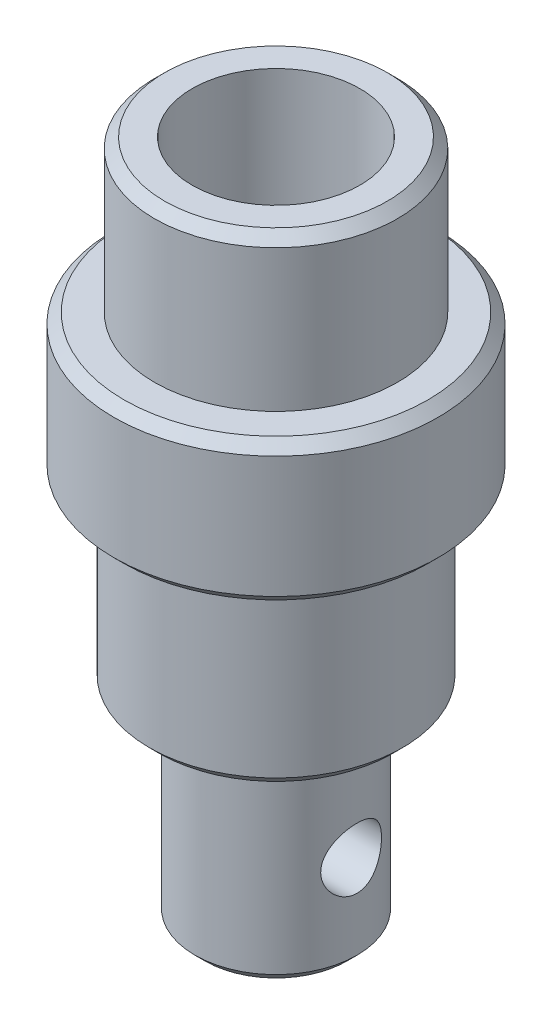
ISO-10303-21;
HEADER;
FILE_DESCRIPTION(('STEP AP214'),'2;1');
FILE_NAME('part.step','',(''),(''),'','','');
FILE_SCHEMA(('AUTOMOTIVE_DESIGN { 1 0 10303 214 1 1 1 1 }'));
ENDSEC;
DATA;
#1=APPLICATION_CONTEXT('core data for automotive mechanical design processes');
#2=APPLICATION_PROTOCOL_DEFINITION('international standard','automotive_design',2000,#1);
#3=PRODUCT_CONTEXT('',#1,'mechanical');
#4=PRODUCT('Part','Part','',(#3));
#5=PRODUCT_RELATED_PRODUCT_CATEGORY('part','',(#4));
#6=PRODUCT_DEFINITION_FORMATION('','',#4);
#7=PRODUCT_DEFINITION_CONTEXT('part definition',#1,'design');
#8=PRODUCT_DEFINITION('design','',#6,#7);
#9=PRODUCT_DEFINITION_SHAPE('','',#8);
#10=(LENGTH_UNIT() NAMED_UNIT(*) SI_UNIT(.MILLI.,.METRE.));
#11=(NAMED_UNIT(*) PLANE_ANGLE_UNIT() SI_UNIT($,.RADIAN.));
#12=(NAMED_UNIT(*) SI_UNIT($,.STERADIAN.) SOLID_ANGLE_UNIT());
#13=UNCERTAINTY_MEASURE_WITH_UNIT(LENGTH_MEASURE(1.E-05),#10,'distance_accuracy_value','');
#14=(GEOMETRIC_REPRESENTATION_CONTEXT(3) GLOBAL_UNCERTAINTY_ASSIGNED_CONTEXT((#13)) GLOBAL_UNIT_ASSIGNED_CONTEXT((#10,
#11,#12)) REPRESENTATION_CONTEXT('',''));
#15=CARTESIAN_POINT('',(0.,0.,0.));
#16=DIRECTION('',(0.,0.,1.));
#17=DIRECTION('',(1.,0.,0.));
#18=AXIS2_PLACEMENT_3D('',#15,#16,#17);
#19=CARTESIAN_POINT('',(0.,67.,0.));
#20=DIRECTION('',(0.,-1.,0.));
#21=DIRECTION('',(0.,0.,-1.));
#22=AXIS2_PLACEMENT_3D('',#19,#20,#21);
#23=CYLINDRICAL_SURFACE('',#22,12.5);
#24=CARTESIAN_POINT('',(0.,21.,0.));
#25=DIRECTION('',(0.,-1.,0.));
#26=DIRECTION('',(0.,0.,-1.));
#27=AXIS2_PLACEMENT_3D('',#24,#25,#26);
#28=CIRCLE('',#27,12.5);
#29=CARTESIAN_POINT('',(0.,21.,-12.5));
#30=VERTEX_POINT('',#29);
#31=EDGE_CURVE('E58',#30,#30,#28,.F.);
#32=ORIENTED_EDGE('',*,*,#31,.T.);
#33=EDGE_LOOP('',(#32));
#34=FACE_BOUND('',#33,.T.);
#35=CARTESIAN_POINT('',(0.,38.,0.));
#36=DIRECTION('',(0.,1.,0.));
#37=DIRECTION('',(0.,0.,1.));
#38=AXIS2_PLACEMENT_3D('',#35,#36,#37);
#39=CIRCLE('',#38,12.5);
#40=CARTESIAN_POINT('',(0.,38.,12.5));
#41=VERTEX_POINT('',#40);
#42=EDGE_CURVE('E152',#41,#41,#39,.T.);
#43=ORIENTED_EDGE('',*,*,#42,.F.);
#44=EDGE_LOOP('',(#43));
#45=FACE_BOUND('',#44,.T.);
#46=ADVANCED_FACE('F39',(#34,#45),#23,.T.);
#47=CARTESIAN_POINT('',(0.,38.,0.));
#48=DIRECTION('',(0.,1.,0.));
#49=DIRECTION('',(0.,0.,1.));
#50=AXIS2_PLACEMENT_3D('',#47,#48,#49);
#51=CYLINDRICAL_SURFACE('',#50,16.);
#52=CARTESIAN_POINT('',(0.,51.,0.));
#53=DIRECTION('',(0.,1.,0.));
#54=DIRECTION('',(0.,0.,1.));
#55=AXIS2_PLACEMENT_3D('',#52,#53,#54);
#56=CIRCLE('',#55,16.);
#57=CARTESIAN_POINT('',(0.,51.,16.));
#58=VERTEX_POINT('',#57);
#59=EDGE_CURVE('E146',#58,#58,#56,.F.);
#60=CARTESIAN_POINT('',(0.,39.,0.));
#61=DIRECTION('',(0.,1.,0.));
#62=DIRECTION('',(0.,0.,1.));
#63=AXIS2_PLACEMENT_3D('',#60,#61,#62);
#64=CIRCLE('',#63,16.);
#65=CARTESIAN_POINT('',(0.,39.,16.));
#66=VERTEX_POINT('',#65);
#67=EDGE_CURVE('E149',#66,#66,#64,.T.);
#68=CARTESIAN_POINT('',(0.,51.,16.));
#69=CARTESIAN_POINT('',(0.,50.875,16.));
#70=CARTESIAN_POINT('',(0.,50.75,16.));
#71=CARTESIAN_POINT('',(0.,50.5,16.));
#72=CARTESIAN_POINT('',(0.,50.375,16.));
#73=CARTESIAN_POINT('',(0.,50.125,16.));
#74=CARTESIAN_POINT('',(0.,50.,16.));
#75=CARTESIAN_POINT('',(0.,49.75,16.));
#76=CARTESIAN_POINT('',(0.,49.625,16.));
#77=CARTESIAN_POINT('',(0.,49.375,16.));
#78=CARTESIAN_POINT('',(0.,49.25,16.));
#79=CARTESIAN_POINT('',(0.,49.,16.));
#80=CARTESIAN_POINT('',(0.,48.875,16.));
#81=CARTESIAN_POINT('',(0.,48.625,16.));
#82=CARTESIAN_POINT('',(0.,48.5,16.));
#83=CARTESIAN_POINT('',(0.,48.25,16.));
#84=CARTESIAN_POINT('',(0.,48.125,16.));
#85=CARTESIAN_POINT('',(0.,47.875,16.));
#86=CARTESIAN_POINT('',(0.,47.75,16.));
#87=CARTESIAN_POINT('',(0.,47.5,16.));
#88=CARTESIAN_POINT('',(0.,47.375,16.));
#89=CARTESIAN_POINT('',(0.,47.125,16.));
#90=CARTESIAN_POINT('',(0.,47.,16.));
#91=CARTESIAN_POINT('',(0.,46.75,16.));
#92=CARTESIAN_POINT('',(0.,46.625,16.));
#93=CARTESIAN_POINT('',(0.,46.375,16.));
#94=CARTESIAN_POINT('',(0.,46.25,16.));
#95=CARTESIAN_POINT('',(0.,46.,16.));
#96=CARTESIAN_POINT('',(0.,45.875,16.));
#97=CARTESIAN_POINT('',(0.,45.625,16.));
#98=CARTESIAN_POINT('',(0.,45.5,16.));
#99=CARTESIAN_POINT('',(0.,45.25,16.));
#100=CARTESIAN_POINT('',(0.,45.125,16.));
#101=CARTESIAN_POINT('',(0.,44.875,16.));
#102=CARTESIAN_POINT('',(0.,44.75,16.));
#103=CARTESIAN_POINT('',(0.,44.5,16.));
#104=CARTESIAN_POINT('',(0.,44.375,16.));
#105=CARTESIAN_POINT('',(0.,44.125,16.));
#106=CARTESIAN_POINT('',(0.,44.,16.));
#107=CARTESIAN_POINT('',(0.,43.75,16.));
#108=CARTESIAN_POINT('',(0.,43.625,16.));
#109=CARTESIAN_POINT('',(0.,43.375,16.));
#110=CARTESIAN_POINT('',(0.,43.25,16.));
#111=CARTESIAN_POINT('',(0.,43.,16.));
#112=CARTESIAN_POINT('',(0.,42.875,16.));
#113=CARTESIAN_POINT('',(0.,42.625,16.));
#114=CARTESIAN_POINT('',(0.,42.5,16.));
#115=CARTESIAN_POINT('',(0.,42.25,16.));
#116=CARTESIAN_POINT('',(0.,42.125,16.));
#117=CARTESIAN_POINT('',(0.,41.875,16.));
#118=CARTESIAN_POINT('',(0.,41.75,16.));
#119=CARTESIAN_POINT('',(0.,41.5,16.));
#120=CARTESIAN_POINT('',(0.,41.375,16.));
#121=CARTESIAN_POINT('',(0.,41.125,16.));
#122=CARTESIAN_POINT('',(0.,41.,16.));
#123=CARTESIAN_POINT('',(0.,40.75,16.));
#124=CARTESIAN_POINT('',(0.,40.625,16.));
#125=CARTESIAN_POINT('',(0.,40.375,16.));
#126=CARTESIAN_POINT('',(0.,40.25,16.));
#127=CARTESIAN_POINT('',(0.,40.,16.));
#128=CARTESIAN_POINT('',(0.,39.875,16.));
#129=CARTESIAN_POINT('',(0.,39.625,16.));
#130=CARTESIAN_POINT('',(0.,39.5,16.));
#131=CARTESIAN_POINT('',(0.,39.25,16.));
#132=CARTESIAN_POINT('',(0.,39.125,16.));
#133=CARTESIAN_POINT('',(0.,39.,16.));
#134=B_SPLINE_CURVE_WITH_KNOTS('',3,(#68,#69,#70,#71,#72,#73,#74,#75,#76,#77,#78,#79,#80,#81,
#82,#83,#84,#85,#86,#87,#88,#89,#90,#91,#92,#93,#94,#95,#96,#97,#98,#99,#100,#101,#102,#103,
#104,#105,#106,#107,#108,#109,#110,#111,#112,#113,#114,#115,#116,#117,#118,#119,#120,#121,#122,
#123,#124,#125,#126,#127,#128,#129,#130,#131,#132,#133),.UNSPECIFIED.,.F.,.F.,(4,2,2,2,2,2,2,2,
2,2,2,2,2,2,2,2,2,2,2,2,2,2,2,2,2,2,2,2,2,2,2,2,4),(0.,0.374999999999993,0.749999999999994,
1.12499999999999,1.49999999999999,1.87499999999999,2.24999999999999,2.62499999999999,
2.99999999999999,3.37499999999998,3.74999999999998,4.12499999999998,4.49999999999998,
4.87499999999998,5.24999999999998,5.62499999999998,5.99999999999998,6.37499999999997,
6.74999999999997,7.12499999999997,7.49999999999997,7.87499999999997,8.24999999999997,
8.62499999999997,8.99999999999997,9.37499999999996,9.74999999999996,10.125,10.5,10.875,11.25,
11.625,12.),.UNSPECIFIED.);
#135=EDGE_CURVE('BSEAM82',#58,#66,#134,.T.);
#136=ORIENTED_EDGE('',*,*,#59,.T.);
#137=ORIENTED_EDGE('',*,*,#67,.T.);
#138=ORIENTED_EDGE('',*,*,#135,.T.);
#139=ORIENTED_EDGE('',*,*,#135,.F.);
#140=EDGE_LOOP('',(#136,#138,#137,#139));
#141=FACE_BOUND('',#140,.T.);
#142=ADVANCED_FACE('F82',(#141),#51,.T.);
#143=CARTESIAN_POINT('',(0.,38.,0.));
#144=DIRECTION('',(0.,1.,0.));
#145=DIRECTION('',(0.,0.,1.));
#146=AXIS2_PLACEMENT_3D('',#143,#144,#145);
#147=PLANE('',#146);
#148=CARTESIAN_POINT('',(0.,38.,0.));
#149=DIRECTION('',(0.,1.,0.));
#150=DIRECTION('',(0.,0.,1.));
#151=AXIS2_PLACEMENT_3D('',#148,#149,#150);
#152=CIRCLE('',#151,15.);
#153=CARTESIAN_POINT('',(0.,38.,15.));
#154=VERTEX_POINT('',#153);
#155=EDGE_CURVE('E140',#154,#154,#152,.F.);
#156=ORIENTED_EDGE('',*,*,#155,.T.);
#157=EDGE_LOOP('',(#156));
#158=FACE_BOUND('',#157,.T.);
#159=ORIENTED_EDGE('',*,*,#42,.T.);
#160=EDGE_LOOP('',(#159));
#161=FACE_BOUND('',#160,.T.);
#162=ADVANCED_FACE('F88',(#158,#161),#147,.F.);
#163=CARTESIAN_POINT('',(0.,52.,0.));
#164=DIRECTION('',(0.,1.,0.));
#165=DIRECTION('',(0.,0.,1.));
#166=AXIS2_PLACEMENT_3D('',#163,#164,#165);
#167=PLANE('',#166);
#168=CARTESIAN_POINT('',(0.,52.,0.));
#169=DIRECTION('',(0.,1.,0.));
#170=DIRECTION('',(0.,0.,1.));
#171=AXIS2_PLACEMENT_3D('',#168,#169,#170);
#172=CIRCLE('',#171,15.);
#173=CARTESIAN_POINT('',(0.,52.,15.));
#174=VERTEX_POINT('',#173);
#175=EDGE_CURVE('E143',#174,#174,#172,.T.);
#176=ORIENTED_EDGE('',*,*,#175,.T.);
#177=EDGE_LOOP('',(#176));
#178=FACE_BOUND('',#177,.T.);
#179=CARTESIAN_POINT('',(-1.87350135405495E-13,52.,3.99712814930231E-12));
#180=DIRECTION('',(0.,1.,0.));
#181=DIRECTION('',(0.,0.,1.));
#182=AXIS2_PLACEMENT_3D('',#179,#180,#181);
#183=CIRCLE('',#182,12.);
#184=CARTESIAN_POINT('',(-1.87350135405495E-13,52.,12.000000000004));
#185=VERTEX_POINT('',#184);
#186=EDGE_CURVE('E159',#185,#185,#183,.T.);
#187=ORIENTED_EDGE('',*,*,#186,.F.);
#188=EDGE_LOOP('',(#187));
#189=FACE_BOUND('',#188,.T.);
#190=ADVANCED_FACE('F186',(#178,#189),#167,.T.);
#191=CARTESIAN_POINT('',(-1.87350135405495E-13,52.,3.99712814930231E-12));
#192=DIRECTION('',(0.,1.,0.));
#193=DIRECTION('',(0.,0.,1.));
#194=AXIS2_PLACEMENT_3D('',#191,#192,#193);
#195=CYLINDRICAL_SURFACE('',#194,12.);
#196=CARTESIAN_POINT('',(-1.87350135405495E-13,66.,3.99712814930231E-12));
#197=DIRECTION('',(0.,1.,0.));
#198=DIRECTION('',(0.,0.,1.));
#199=AXIS2_PLACEMENT_3D('',#196,#197,#198);
#200=CIRCLE('',#199,12.);
#201=CARTESIAN_POINT('',(-1.87350135405495E-13,66.,12.000000000004));
#202=VERTEX_POINT('',#201);
#203=EDGE_CURVE('E132',#202,#202,#200,.F.);
#204=ORIENTED_EDGE('',*,*,#203,.T.);
#205=EDGE_LOOP('',(#204));
#206=FACE_BOUND('',#205,.T.);
#207=ORIENTED_EDGE('',*,*,#186,.T.);
#208=EDGE_LOOP('',(#207));
#209=FACE_BOUND('',#208,.T.);
#210=ADVANCED_FACE('F182',(#206,#209),#195,.T.);
#211=CARTESIAN_POINT('',(0.,49.,0.));
#212=DIRECTION('',(0.,1.,0.));
#213=DIRECTION('',(0.,0.,1.));
#214=AXIS2_PLACEMENT_3D('',#211,#212,#213);
#215=PLANE('',#214);
#216=CARTESIAN_POINT('',(0.,49.,0.));
#217=DIRECTION('',(0.,1.,0.));
#218=DIRECTION('',(0.,0.,1.));
#219=AXIS2_PLACEMENT_3D('',#216,#217,#218);
#220=CIRCLE('',#219,8.2804);
#221=CARTESIAN_POINT('',(0.,49.,8.2804));
#222=VERTEX_POINT('',#221);
#223=EDGE_CURVE('E155',#222,#222,#220,.T.);
#224=ORIENTED_EDGE('',*,*,#223,.T.);
#225=EDGE_LOOP('',(#224));
#226=FACE_BOUND('',#225,.T.);
#227=ADVANCED_FACE('F185',(#226),#215,.T.);
#228=CARTESIAN_POINT('',(0.,49.,0.));
#229=DIRECTION('',(0.,1.,0.));
#230=DIRECTION('',(0.,0.,1.));
#231=AXIS2_PLACEMENT_3D('',#228,#229,#230);
#232=CYLINDRICAL_SURFACE('',#231,8.2804);
#233=ORIENTED_EDGE('',*,*,#223,.F.);
#234=EDGE_LOOP('',(#233));
#235=FACE_BOUND('',#234,.T.);
#236=CARTESIAN_POINT('',(0.,67.,0.));
#237=DIRECTION('',(0.,1.,0.));
#238=DIRECTION('',(0.,0.,1.));
#239=AXIS2_PLACEMENT_3D('',#236,#237,#238);
#240=CIRCLE('',#239,8.2804);
#241=CARTESIAN_POINT('',(0.,67.,8.2804));
#242=VERTEX_POINT('',#241);
#243=EDGE_CURVE('E156',#242,#242,#240,.T.);
#244=ORIENTED_EDGE('',*,*,#243,.T.);
#245=EDGE_LOOP('',(#244));
#246=FACE_BOUND('',#245,.T.);
#247=ADVANCED_FACE('F193',(#235,#246),#232,.F.);
#248=CARTESIAN_POINT('',(0.,67.,0.));
#249=DIRECTION('',(0.,1.,0.));
#250=DIRECTION('',(0.,0.,1.));
#251=AXIS2_PLACEMENT_3D('',#248,#249,#250);
#252=PLANE('',#251);
#253=CARTESIAN_POINT('',(-1.87350135405495E-13,67.,3.99712814930231E-12));
#254=DIRECTION('',(0.,1.,0.));
#255=DIRECTION('',(0.,0.,1.));
#256=AXIS2_PLACEMENT_3D('',#253,#254,#255);
#257=CIRCLE('',#256,11.);
#258=CARTESIAN_POINT('',(-1.87350135405495E-13,67.,11.000000000004));
#259=VERTEX_POINT('',#258);
#260=EDGE_CURVE('E135',#259,#259,#257,.T.);
#261=ORIENTED_EDGE('',*,*,#260,.T.);
#262=EDGE_LOOP('',(#261));
#263=FACE_BOUND('',#262,.T.);
#264=ORIENTED_EDGE('',*,*,#243,.F.);
#265=EDGE_LOOP('',(#264));
#266=FACE_BOUND('',#265,.T.);
#267=ADVANCED_FACE('F105',(#263,#266),#252,.T.);
#268=CARTESIAN_POINT('',(0.,51.,0.));
#269=DIRECTION('',(0.,-1.,0.));
#270=DIRECTION('',(0.,0.,-1.));
#271=AXIS2_PLACEMENT_3D('',#268,#269,#270);
#272=CONICAL_SURFACE('',#271,16.,0.785398163397454);
#273=ORIENTED_EDGE('',*,*,#175,.F.);
#274=EDGE_LOOP('',(#273));
#275=FACE_BOUND('',#274,.T.);
#276=ORIENTED_EDGE('',*,*,#59,.F.);
#277=EDGE_LOOP('',(#276));
#278=FACE_BOUND('',#277,.T.);
#279=ADVANCED_FACE('F98',(#275,#278),#272,.T.);
#280=CARTESIAN_POINT('',(0.,39.,0.));
#281=DIRECTION('',(0.,1.,0.));
#282=DIRECTION('',(0.,0.,1.));
#283=AXIS2_PLACEMENT_3D('',#280,#281,#282);
#284=CONICAL_SURFACE('',#283,16.,0.785398163397457);
#285=ORIENTED_EDGE('',*,*,#155,.F.);
#286=EDGE_LOOP('',(#285));
#287=FACE_BOUND('',#286,.T.);
#288=ORIENTED_EDGE('',*,*,#67,.F.);
#289=EDGE_LOOP('',(#288));
#290=FACE_BOUND('',#289,.T.);
#291=ADVANCED_FACE('F104',(#287,#290),#284,.T.);
#292=CARTESIAN_POINT('',(0.,20.,0.));
#293=DIRECTION('',(0.,-1.,0.));
#294=DIRECTION('',(0.,0.,-1.));
#295=AXIS2_PLACEMENT_3D('',#292,#293,#294);
#296=PLANE('',#295);
#297=CARTESIAN_POINT('',(0.,20.,0.));
#298=DIRECTION('',(0.,-1.,0.));
#299=DIRECTION('',(0.,0.,-1.));
#300=AXIS2_PLACEMENT_3D('',#297,#298,#299);
#301=CIRCLE('',#300,11.5);
#302=CARTESIAN_POINT('',(0.,20.,-11.5));
#303=VERTEX_POINT('',#302);
#304=EDGE_CURVE('E130',#303,#303,#301,.T.);
#305=ORIENTED_EDGE('',*,*,#304,.T.);
#306=EDGE_LOOP('',(#305));
#307=FACE_BOUND('',#306,.T.);
#308=CARTESIAN_POINT('',(0.,20.,0.));
#309=DIRECTION('',(0.,-1.,0.));
#310=DIRECTION('',(0.,0.,-1.));
#311=AXIS2_PLACEMENT_3D('',#308,#309,#310);
#312=CIRCLE('',#311,8.);
#313=CARTESIAN_POINT('',(0.,20.,-8.));
#314=VERTEX_POINT('',#313);
#315=EDGE_CURVE('E164',#314,#314,#312,.T.);
#316=ORIENTED_EDGE('',*,*,#315,.F.);
#317=EDGE_LOOP('',(#316));
#318=FACE_BOUND('',#317,.T.);
#319=ADVANCED_FACE('F112',(#307,#318),#296,.T.);
#320=CARTESIAN_POINT('',(0.,20.,0.));
#321=DIRECTION('',(0.,-1.,0.));
#322=DIRECTION('',(0.,0.,-1.));
#323=AXIS2_PLACEMENT_3D('',#320,#321,#322);
#324=CYLINDRICAL_SURFACE('',#323,8.);
#325=CARTESIAN_POINT('',(-7.41619848709564,9.29999999999999,-3.00000000000005));
#326=CARTESIAN_POINT('',(-7.41619281215224,9.13798503251658,-3.00000608211293));
#327=CARTESIAN_POINT('',(-7.42156520296311,8.9760101548738,-2.98683195095369));
#328=CARTESIAN_POINT('',(-7.44232318425764,8.65694383406477,-2.93472375787488));
#329=CARTESIAN_POINT('',(-7.45770847484801,8.49985224478831,-2.89579046745937));
#330=CARTESIAN_POINT('',(-7.4965096061089,8.19524925681116,-2.79379315222302));
#331=CARTESIAN_POINT('',(-7.51990619151694,8.04771588670808,-2.7307869453301));
#332=CARTESIAN_POINT('',(-7.57206268400016,7.76525620635205,-2.58263713485092));
#333=CARTESIAN_POINT('',(-7.60082420131041,7.63033369943214,-2.49748688189998));
#334=CARTESIAN_POINT('',(-7.66207149335191,7.37021937675728,-2.30293322748418));
#335=CARTESIAN_POINT('',(-7.69466683848216,7.24574294074199,-2.19260762426641));
#336=CARTESIAN_POINT('',(-7.75899501256082,7.01655437065623,-1.95279167955767));
#337=CARTESIAN_POINT('',(-7.79072765629294,6.91184645251607,-1.82329726051335));
#338=CARTESIAN_POINT('',(-7.85105747873389,6.72172097540899,-1.54338931035532));
#339=CARTESIAN_POINT('',(-7.87951122447086,6.63708105056833,-1.39241389507613));
#340=CARTESIAN_POINT('',(-7.92876015947619,6.49469765495011,-1.07711154393053));
#341=CARTESIAN_POINT('',(-7.94955800433993,6.43694485601602,-0.91278926186712));
#342=CARTESIAN_POINT('',(-7.98037394206897,6.35248420845077,-0.582978683353724));
#343=CARTESIAN_POINT('',(-7.99081830429549,6.32454474511908,-0.417846394563251));
#344=CARTESIAN_POINT('',(-8.0012802821588,6.29655759811001,-0.0849287275896202));
#345=CARTESIAN_POINT('',(-8.0013012882982,6.29650084476258,0.082855770125627));
#346=CARTESIAN_POINT('',(-7.99118531807774,6.32356352293031,0.407487086128887));
#347=CARTESIAN_POINT('',(-7.98155083993307,6.34933859589754,0.564464356533702));
#348=CARTESIAN_POINT('',(-7.95386549864586,6.42507183045117,0.871678435968775));
#349=CARTESIAN_POINT('',(-7.93581403951379,6.47503170452433,1.02191476686071));
#350=CARTESIAN_POINT('',(-7.89275538334836,6.59834090335141,1.31397803460599));
#351=CARTESIAN_POINT('',(-7.86765078939304,6.67202001053578,1.45565078457392));
#352=CARTESIAN_POINT('',(-7.8130262045141,6.84038419385979,1.72497321591571));
#353=CARTESIAN_POINT('',(-7.78350479028859,6.93507604603902,1.852618353867));
#354=CARTESIAN_POINT('',(-7.7210505930827,7.1492545725623,2.09818097359927));
#355=CARTESIAN_POINT('',(-7.68801927514872,7.26986783128529,2.21509229051715));
#356=CARTESIAN_POINT('',(-7.62364921304343,7.52918598665865,2.42740791139655));
#357=CARTESIAN_POINT('',(-7.59231089545928,7.66789541323141,2.52280681389444));
#358=CARTESIAN_POINT('',(-7.53425406951151,7.96343893487734,2.69131223613203));
#359=CARTESIAN_POINT('',(-7.50765354114237,8.12060698717144,2.76387695690672));
#360=CARTESIAN_POINT('',(-7.46344877072312,8.44619245012775,2.88112928869842));
#361=CARTESIAN_POINT('',(-7.44583952363155,8.61460354312569,2.92583241207695));
#362=CARTESIAN_POINT('',(-7.42279194491543,8.94795192467547,2.98380383422373));
#363=CARTESIAN_POINT('',(-7.41673570495339,9.11256821108393,2.99867042318741));
#364=CARTESIAN_POINT('',(-7.41573079037774,9.44201871347182,3.00115771271726));
#365=CARTESIAN_POINT('',(-7.42077934004764,9.60685286470187,2.98878522187305));
#366=CARTESIAN_POINT('',(-7.44078763262531,9.92385984457825,2.93859467040512));
#367=CARTESIAN_POINT('',(-7.4552655243372,10.0762622715301,2.90201236668499));
#368=CARTESIAN_POINT('',(-7.49192974091904,10.3726958894396,2.80599549281216));
#369=CARTESIAN_POINT('',(-7.51411764500123,10.516725358336,2.74655624069226));
#370=CARTESIAN_POINT('',(-7.56472486232393,10.7983288761526,2.60400584550566));
#371=CARTESIAN_POINT('',(-7.59334657784194,10.9354585842747,2.52009090354093));
#372=CARTESIAN_POINT('',(-7.65325628588521,11.194257963452,2.33182635724949));
#373=CARTESIAN_POINT('',(-7.68454525188138,11.3159219492492,2.22746927392863));
#374=CARTESIAN_POINT('',(-7.74866093106388,11.5483367463902,1.99345468180184));
#375=CARTESIAN_POINT('',(-7.78145938714061,11.6579068175375,1.86261268298208));
#376=CARTESIAN_POINT('',(-7.842997499266,11.8536767351789,1.58359494350625));
#377=CARTESIAN_POINT('',(-7.87173714215328,11.9398765058917,1.4354191466453));
#378=CARTESIAN_POINT('',(-7.92189971409106,12.0858921123992,1.1260326589369));
#379=CARTESIAN_POINT('',(-7.94334762676021,12.1457982475852,0.964868866129202));
#380=CARTESIAN_POINT('',(-7.97658873425142,12.2373128276998,0.633763775046458));
#381=CARTESIAN_POINT('',(-7.98838646598825,12.2689345708448,0.463826641447135));
#382=CARTESIAN_POINT('',(-8.00056814634147,12.3015488055096,0.130671170547581));
#383=CARTESIAN_POINT('',(-8.00157721907528,12.304218966118,-0.0323615361217405));
#384=CARTESIAN_POINT('',(-7.99369779618447,12.2831696811092,-0.356453572824897));
#385=CARTESIAN_POINT('',(-7.98481049426261,12.2594534182283,-0.517513138490563));
#386=CARTESIAN_POINT('',(-7.95842179207541,12.1874822970127,-0.829096496754301));
#387=CARTESIAN_POINT('',(-7.94113582756029,12.1398401882433,-0.979781462137719));
#388=CARTESIAN_POINT('',(-7.89975567241983,12.0219799732313,-1.27103094601283));
#389=CARTESIAN_POINT('',(-7.87566019311344,11.9517575933905,-1.41159354255114));
#390=CARTESIAN_POINT('',(-7.82181236600129,11.7873721129904,-1.68508035398887));
#391=CARTESIAN_POINT('',(-7.79186480217586,11.6923267189717,-1.81743509769374));
#392=CARTESIAN_POINT('',(-7.72999015389758,11.4823843396248,-2.06483469504679));
#393=CARTESIAN_POINT('',(-7.69806236548315,11.3674802683844,-2.17987334251189));
#394=CARTESIAN_POINT('',(-7.63376259478072,11.1138717367097,-2.39562428472391));
#395=CARTESIAN_POINT('',(-7.60145610697261,10.9742311956909,-2.49525999632037));
#396=CARTESIAN_POINT('',(-7.54196650008332,10.6791682608538,-2.6696941911371));
#397=CARTESIAN_POINT('',(-7.51478391266384,10.5237442318947,-2.74449009756389));
#398=CARTESIAN_POINT('',(-7.46804539702404,10.1940886380474,-2.86931773948452));
#399=CARTESIAN_POINT('',(-7.44887606566001,10.0193312669696,-2.91812005798771));
#400=CARTESIAN_POINT('',(-7.42295988688335,9.66302945609526,-2.98344713444442));
#401=CARTESIAN_POINT('',(-7.41620484418153,9.48148957460556,-2.99999318680189));
#402=CARTESIAN_POINT('',(-7.41619848709564,9.29999999999999,-3.00000000000005));
#403=B_SPLINE_CURVE_WITH_KNOTS('',3,(#325,#326,#327,#328,#329,#330,#331,#332,#333,#334,#335,
#336,#337,#338,#339,#340,#341,#342,#343,#344,#345,#346,#347,#348,#349,#350,#351,#352,#353,#354,
#355,#356,#357,#358,#359,#360,#361,#362,#363,#364,#365,#366,#367,#368,#369,#370,#371,#372,#373,
#374,#375,#376,#377,#378,#379,#380,#381,#382,#383,#384,#385,#386,#387,#388,#389,#390,#391,#392,
#393,#394,#395,#396,#397,#398,#399,#400,#401,#402),.UNSPECIFIED.,.T.,.F.,(4,2,2,2,2,2,2,2,2,2,2,
2,2,2,2,2,2,2,2,2,2,2,2,2,2,2,2,2,2,2,2,2,2,2,2,2,2,2,4),(0.,0.485369082889298,
0.970723629307669,1.45491971362402,1.93926135947583,2.44549304813252,2.95183257656962,
3.47540144283838,3.99878852773656,4.49960036990354,5.0002493082071,5.47612945617385,
5.95204330537667,6.43488262432332,6.91787787268947,7.42913350142745,7.94051735665665,
8.46325184520832,8.98569503290589,9.47931315500611,9.97280790797409,10.4428769187604,
10.9130422687869,11.4008312203128,11.8887989695235,12.4077003400689,12.9266033932,
13.4437101779998,13.9605737113989,14.4473144111951,14.933996406586,15.4088054802742,
15.883704470453,16.3785664737361,16.8736054180957,17.394771991038,17.9159926110812,
18.4600635776149,19.0037752466575),.UNSPECIFIED.);
#404=CARTESIAN_POINT('',(-7.41619848709564,9.29999999999999,-3.00000000000005));
#405=VERTEX_POINT('',#404);
#406=EDGE_CURVE('E44',#405,#405,#403,.T.);
#407=ORIENTED_EDGE('',*,*,#406,.F.);
#408=EDGE_LOOP('',(#407));
#409=FACE_BOUND('',#408,.T.);
#410=CARTESIAN_POINT('',(7.41619848709564,9.29999999999999,-3.00000000000005));
#411=CARTESIAN_POINT('',(7.41619281215224,9.46201496748339,-3.00000608211293));
#412=CARTESIAN_POINT('',(7.42156520296311,9.62398984512618,-2.98683195095369));
#413=CARTESIAN_POINT('',(7.44232318425764,9.94305616593521,-2.93472375787488));
#414=CARTESIAN_POINT('',(7.45770847484802,10.1001477552117,-2.89579046745937));
#415=CARTESIAN_POINT('',(7.4965096061089,10.4047507431888,-2.79379315222302));
#416=CARTESIAN_POINT('',(7.51990619151694,10.5522841132919,-2.73078694533011));
#417=CARTESIAN_POINT('',(7.57206268400016,10.8347437936479,-2.58263713485092));
#418=CARTESIAN_POINT('',(7.60082420131041,10.9696663005678,-2.49748688189998));
#419=CARTESIAN_POINT('',(7.66207149335191,11.2297806232427,-2.30293322748417));
#420=CARTESIAN_POINT('',(7.69466683848216,11.354257059258,-2.19260762426642));
#421=CARTESIAN_POINT('',(7.75899501256081,11.5834456293438,-1.95279167955767));
#422=CARTESIAN_POINT('',(7.79072765629293,11.6881535474839,-1.82329726051335));
#423=CARTESIAN_POINT('',(7.85105747873389,11.878279024591,-1.54338931035532));
#424=CARTESIAN_POINT('',(7.87951122447086,11.9629189494316,-1.39241389507613));
#425=CARTESIAN_POINT('',(7.92876015947619,12.1053023450499,-1.07711154393053));
#426=CARTESIAN_POINT('',(7.94955800433993,12.163055143984,-0.912789261867119));
#427=CARTESIAN_POINT('',(7.98037394206896,12.2475157915492,-0.582978683353722));
#428=CARTESIAN_POINT('',(7.99081830429549,12.2754552548809,-0.41784639456325));
#429=CARTESIAN_POINT('',(8.0012802821588,12.30344240189,-0.0849287275896189));
#430=CARTESIAN_POINT('',(8.0013012882982,12.3034991552374,0.0828557701256284));
#431=CARTESIAN_POINT('',(7.99118531807774,12.2764364770697,0.40748708612889));
#432=CARTESIAN_POINT('',(7.98155083993307,12.2506614041024,0.564464356533706));
#433=CARTESIAN_POINT('',(7.95386549864586,12.1749281695488,0.871678435968779));
#434=CARTESIAN_POINT('',(7.93581403951379,12.1249682954756,1.02191476686072));
#435=CARTESIAN_POINT('',(7.89275538334836,12.0016590966486,1.31397803460599));
#436=CARTESIAN_POINT('',(7.86765078939304,11.9279799894642,1.45565078457393));
#437=CARTESIAN_POINT('',(7.8130262045141,11.7596158061402,1.72497321591571));
#438=CARTESIAN_POINT('',(7.78350479028859,11.6649239539609,1.852618353867));
#439=CARTESIAN_POINT('',(7.7210505930827,11.4507454274377,2.09818097359928));
#440=CARTESIAN_POINT('',(7.68801927514872,11.3301321687147,2.21509229051716));
#441=CARTESIAN_POINT('',(7.62364921304343,11.0708140133413,2.42740791139656));
#442=CARTESIAN_POINT('',(7.59231089545928,10.9321045867686,2.52280681389444));
#443=CARTESIAN_POINT('',(7.53425406951151,10.6365610651226,2.69131223613203));
#444=CARTESIAN_POINT('',(7.50765354114237,10.4793930128285,2.76387695690672));
#445=CARTESIAN_POINT('',(7.46344877072312,10.1538075498722,2.88112928869843));
#446=CARTESIAN_POINT('',(7.44583952363155,9.98539645687427,2.92583241207695));
#447=CARTESIAN_POINT('',(7.42279194491543,9.65204807532449,2.98380383422373));
#448=CARTESIAN_POINT('',(7.41673570495339,9.48743178891604,2.9986704231874));
#449=CARTESIAN_POINT('',(7.41573079037774,9.15798128652815,3.00115771271726));
#450=CARTESIAN_POINT('',(7.42077934004764,8.99314713529809,2.98878522187306));
#451=CARTESIAN_POINT('',(7.44078763262531,8.67614015542171,2.93859467040512));
#452=CARTESIAN_POINT('',(7.4552655243372,8.52373772846988,2.90201236668498));
#453=CARTESIAN_POINT('',(7.49192974091904,8.22730411056037,2.80599549281215));
#454=CARTESIAN_POINT('',(7.51411764500124,8.08327464166392,2.74655624069226));
#455=CARTESIAN_POINT('',(7.56472486232393,7.80167112384735,2.60400584550566));
#456=CARTESIAN_POINT('',(7.59334657784194,7.66454141572525,2.52009090354092));
#457=CARTESIAN_POINT('',(7.65325628588522,7.40574203654796,2.33182635724949));
#458=CARTESIAN_POINT('',(7.68454525188138,7.28407805075073,2.22746927392863));
#459=CARTESIAN_POINT('',(7.74866093106388,7.05166325360977,1.99345468180184));
#460=CARTESIAN_POINT('',(7.78145938714061,6.94209318246248,1.86261268298207));
#461=CARTESIAN_POINT('',(7.842997499266,6.74632326482111,1.58359494350624));
#462=CARTESIAN_POINT('',(7.87173714215328,6.66012349410831,1.43541914664529));
#463=CARTESIAN_POINT('',(7.92189971409106,6.51410788760076,1.1260326589369));
#464=CARTESIAN_POINT('',(7.94334762676021,6.45420175241478,0.964868866129198));
#465=CARTESIAN_POINT('',(7.97658873425143,6.36268717230015,0.633763775046454));
#466=CARTESIAN_POINT('',(7.98838646598825,6.33106542915519,0.463826641447131));
#467=CARTESIAN_POINT('',(8.00056814634146,6.29845119449034,0.130671170547578));
#468=CARTESIAN_POINT('',(8.00157721907528,6.29578103388201,-0.0323615361217421));
#469=CARTESIAN_POINT('',(7.99369779618447,6.31683031889078,-0.356453572824899));
#470=CARTESIAN_POINT('',(7.98481049426261,6.34054658177169,-0.517513138490567));
#471=CARTESIAN_POINT('',(7.95842179207541,6.41251770298722,-0.829096496754303));
#472=CARTESIAN_POINT('',(7.94113582756029,6.4601598117567,-0.979781462137716));
#473=CARTESIAN_POINT('',(7.89975567241983,6.57802002676871,-1.27103094601283));
#474=CARTESIAN_POINT('',(7.87566019311344,6.64824240660948,-1.41159354255114));
#475=CARTESIAN_POINT('',(7.82181236600129,6.81262788700961,-1.68508035398887));
#476=CARTESIAN_POINT('',(7.79186480217586,6.90767328102831,-1.81743509769374));
#477=CARTESIAN_POINT('',(7.72999015389758,7.11761566037517,-2.06483469504678));
#478=CARTESIAN_POINT('',(7.69806236548315,7.23251973161562,-2.17987334251189));
#479=CARTESIAN_POINT('',(7.63376259478072,7.48612826329023,-2.39562428472391));
#480=CARTESIAN_POINT('',(7.60145610697261,7.62576880430907,-2.49525999632037));
#481=CARTESIAN_POINT('',(7.54196650008332,7.92083173914618,-2.6696941911371));
#482=CARTESIAN_POINT('',(7.51478391266384,8.07625576810523,-2.74449009756389));
#483=CARTESIAN_POINT('',(7.46804539702404,8.4059113619526,-2.86931773948452));
#484=CARTESIAN_POINT('',(7.44887606566001,8.5806687330304,-2.91812005798771));
#485=CARTESIAN_POINT('',(7.42295988688335,8.93697054390472,-2.98344713444442));
#486=CARTESIAN_POINT('',(7.41620484418153,9.11851042539442,-2.99999318680189));
#487=CARTESIAN_POINT('',(7.41619848709564,9.29999999999999,-3.00000000000005));
#488=B_SPLINE_CURVE_WITH_KNOTS('',3,(#410,#411,#412,#413,#414,#415,#416,#417,#418,#419,#420,
#421,#422,#423,#424,#425,#426,#427,#428,#429,#430,#431,#432,#433,#434,#435,#436,#437,#438,#439,
#440,#441,#442,#443,#444,#445,#446,#447,#448,#449,#450,#451,#452,#453,#454,#455,#456,#457,#458,
#459,#460,#461,#462,#463,#464,#465,#466,#467,#468,#469,#470,#471,#472,#473,#474,#475,#476,#477,
#478,#479,#480,#481,#482,#483,#484,#485,#486,#487),.UNSPECIFIED.,.T.,.F.,(4,2,2,2,2,2,2,2,2,2,2,
2,2,2,2,2,2,2,2,2,2,2,2,2,2,2,2,2,2,2,2,2,2,2,2,2,2,2,4),(0.,0.485369082889298,
0.970723629307669,1.45491971362401,1.93926135947582,2.44549304813251,2.95183257656962,
3.47540144283838,3.99878852773656,4.49960036990354,5.00024930820711,5.47612945617385,
5.95204330537667,6.43488262432332,6.91787787268948,7.42913350142746,7.94051735665666,
8.46325184520833,8.9856950329059,9.47931315500611,9.9728079079741,10.4428769187604,
10.9130422687869,11.4008312203128,11.8887989695235,12.4077003400689,12.9266033932,
13.4437101779998,13.9605737113989,14.4473144111951,14.933996406586,15.4088054802742,
15.883704470453,16.3785664737361,16.8736054180957,17.394771991038,17.9159926110812,
18.4600635776149,19.0037752466575),.UNSPECIFIED.);
#489=CARTESIAN_POINT('',(7.41619848709564,9.29999999999999,-3.00000000000005));
#490=VERTEX_POINT('',#489);
#491=EDGE_CURVE('E61',#490,#490,#488,.T.);
#492=ORIENTED_EDGE('',*,*,#491,.F.);
#493=EDGE_LOOP('',(#492));
#494=FACE_BOUND('',#493,.T.);
#495=CARTESIAN_POINT('',(0.,1.00000000000001,0.));
#496=DIRECTION('',(0.,1.,0.));
#497=DIRECTION('',(0.,0.,1.));
#498=AXIS2_PLACEMENT_3D('',#495,#496,#497);
#499=CIRCLE('',#498,8.);
#500=CARTESIAN_POINT('',(0.,1.00000000000001,8.));
#501=VERTEX_POINT('',#500);
#502=EDGE_CURVE('E11',#501,#501,#499,.T.);
#503=ORIENTED_EDGE('',*,*,#502,.T.);
#504=EDGE_LOOP('',(#503));
#505=FACE_BOUND('',#504,.T.);
#506=ORIENTED_EDGE('',*,*,#315,.T.);
#507=EDGE_LOOP('',(#506));
#508=FACE_BOUND('',#507,.T.);
#509=ADVANCED_FACE('F66',(#409,#494,#505,#508),#324,.T.);
#510=CARTESIAN_POINT('',(0.,0.,0.));
#511=DIRECTION('',(0.,1.,0.));
#512=DIRECTION('',(0.,0.,1.));
#513=AXIS2_PLACEMENT_3D('',#510,#511,#512);
#514=PLANE('',#513);
#515=CARTESIAN_POINT('',(0.,0.,0.));
#516=DIRECTION('',(0.,1.,0.));
#517=DIRECTION('',(0.,0.,1.));
#518=AXIS2_PLACEMENT_3D('',#515,#516,#517);
#519=CIRCLE('',#518,6.99999999999999);
#520=CARTESIAN_POINT('',(0.,0.,6.99999999999999));
#521=VERTEX_POINT('',#520);
#522=EDGE_CURVE('E53',#521,#521,#519,.F.);
#523=ORIENTED_EDGE('',*,*,#522,.T.);
#524=EDGE_LOOP('',(#523));
#525=FACE_BOUND('',#524,.T.);
#526=ADVANCED_FACE('F95',(#525),#514,.F.);
#527=CARTESIAN_POINT('',(-1.87350135405495E-13,67.,3.99712814930231E-12));
#528=DIRECTION('',(0.,-1.,0.));
#529=DIRECTION('',(0.,0.,-1.));
#530=AXIS2_PLACEMENT_3D('',#527,#528,#529);
#531=CONICAL_SURFACE('',#530,11.,0.785398163397447);
#532=ORIENTED_EDGE('',*,*,#203,.F.);
#533=EDGE_LOOP('',(#532));
#534=FACE_BOUND('',#533,.T.);
#535=ORIENTED_EDGE('',*,*,#260,.F.);
#536=EDGE_LOOP('',(#535));
#537=FACE_BOUND('',#536,.T.);
#538=ADVANCED_FACE('F114',(#534,#537),#531,.T.);
#539=CARTESIAN_POINT('',(0.,20.,0.));
#540=DIRECTION('',(0.,1.,0.));
#541=DIRECTION('',(0.,0.,1.));
#542=AXIS2_PLACEMENT_3D('',#539,#540,#541);
#543=CONICAL_SURFACE('',#542,11.5,0.785398163397447);
#544=ORIENTED_EDGE('',*,*,#31,.F.);
#545=EDGE_LOOP('',(#544));
#546=FACE_BOUND('',#545,.T.);
#547=ORIENTED_EDGE('',*,*,#304,.F.);
#548=EDGE_LOOP('',(#547));
#549=FACE_BOUND('',#548,.T.);
#550=ADVANCED_FACE('F77',(#546,#549),#543,.T.);
#551=CARTESIAN_POINT('',(0.,0.,0.));
#552=DIRECTION('',(0.,1.,0.));
#553=DIRECTION('',(0.,0.,1.));
#554=AXIS2_PLACEMENT_3D('',#551,#552,#553);
#555=CONICAL_SURFACE('',#554,6.99999999999999,0.785398163397445);
#556=ORIENTED_EDGE('',*,*,#502,.F.);
#557=EDGE_LOOP('',(#556));
#558=FACE_BOUND('',#557,.T.);
#559=ORIENTED_EDGE('',*,*,#522,.F.);
#560=EDGE_LOOP('',(#559));
#561=FACE_BOUND('',#560,.T.);
#562=ADVANCED_FACE('F42',(#558,#561),#555,.T.);
#563=CARTESIAN_POINT('',(-16.,9.29999999999999,0.));
#564=DIRECTION('',(1.,0.,0.));
#565=DIRECTION('',(0.,0.,-1.));
#566=AXIS2_PLACEMENT_3D('',#563,#564,#565);
#567=CYLINDRICAL_SURFACE('',#566,3.);
#568=ORIENTED_EDGE('',*,*,#406,.T.);
#569=EDGE_LOOP('',(#568));
#570=FACE_BOUND('',#569,.T.);
#571=ORIENTED_EDGE('',*,*,#491,.T.);
#572=EDGE_LOOP('',(#571));
#573=FACE_BOUND('',#572,.T.);
#574=ADVANCED_FACE('F69',(#570,#573),#567,.F.);
#575=CLOSED_SHELL('',(#46,#142,#162,#190,#210,#227,#247,#267,#279,#291,#319,#509,#526,#538,#550,
#562,#574));
#576=MANIFOLD_SOLID_BREP('B2',#575);
#577=ADVANCED_BREP_SHAPE_REPRESENTATION('',(#18,#576),#14);
#578=SHAPE_DEFINITION_REPRESENTATION(#9,#577);
ENDSEC;
END-ISO-10303-21;
